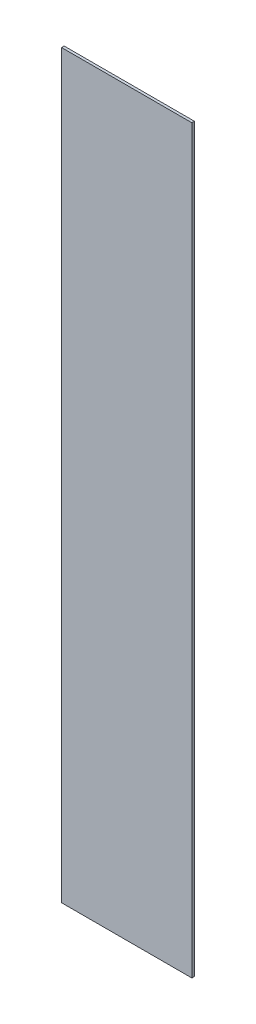
ISO-10303-21;
HEADER;
FILE_DESCRIPTION(('STEP AP214'),'2;1');
FILE_NAME('part.step','',(''),(''),'','','');
FILE_SCHEMA(('AUTOMOTIVE_DESIGN { 1 0 10303 214 1 1 1 1 }'));
ENDSEC;
DATA;
#1=APPLICATION_CONTEXT('core data for automotive mechanical design processes');
#2=APPLICATION_PROTOCOL_DEFINITION('international standard','automotive_design',2000,#1);
#3=PRODUCT_CONTEXT('',#1,'mechanical');
#4=PRODUCT('Part','Part','',(#3));
#5=PRODUCT_RELATED_PRODUCT_CATEGORY('part','',(#4));
#6=PRODUCT_DEFINITION_FORMATION('','',#4);
#7=PRODUCT_DEFINITION_CONTEXT('part definition',#1,'design');
#8=PRODUCT_DEFINITION('design','',#6,#7);
#9=PRODUCT_DEFINITION_SHAPE('','',#8);
#10=(LENGTH_UNIT() NAMED_UNIT(*) SI_UNIT(.MILLI.,.METRE.));
#11=(NAMED_UNIT(*) PLANE_ANGLE_UNIT() SI_UNIT($,.RADIAN.));
#12=(NAMED_UNIT(*) SI_UNIT($,.STERADIAN.) SOLID_ANGLE_UNIT());
#13=UNCERTAINTY_MEASURE_WITH_UNIT(LENGTH_MEASURE(1.E-05),#10,'distance_accuracy_value','');
#14=(GEOMETRIC_REPRESENTATION_CONTEXT(3) GLOBAL_UNCERTAINTY_ASSIGNED_CONTEXT((#13)) GLOBAL_UNIT_ASSIGNED_CONTEXT((#10,
#11,#12)) REPRESENTATION_CONTEXT('',''));
#15=CARTESIAN_POINT('',(0.,0.,0.));
#16=DIRECTION('',(0.,0.,1.));
#17=DIRECTION('',(1.,0.,0.));
#18=AXIS2_PLACEMENT_3D('',#15,#16,#17);
#19=CARTESIAN_POINT('',(92.364667770762,49.250000717584,-2.951522083282));
#20=DIRECTION('',(0.,8.74227765734797E-08,-0.999999999999996));
#21=DIRECTION('',(0.,0.999999999999996,8.74227765734797E-08));
#22=AXIS2_PLACEMENT_3D('',#19,#20,#21);
#23=PLANE('',#22);
#24=DIRECTION('',(1.,0.,0.));
#25=VECTOR('',#24,1.);
#26=CARTESIAN_POINT('',(92.364667770762,49.960334166822,-2.95152202118268));
#27=LINE('',#26,#25);
#28=CARTESIAN_POINT('',(92.239667770762,49.960334166822,-2.95152205223259));
#29=VERTEX_POINT('',#28);
#30=CARTESIAN_POINT('',(92.489667770762,49.9603341669313,-2.95152202118284));
#31=VERTEX_POINT('',#30);
#32=EDGE_CURVE('E20',#29,#31,#27,.T.);
#33=ORIENTED_EDGE('',*,*,#32,.F.);
#34=DIRECTION('',(0.,1.,0.));
#35=VECTOR('',#34,1.);
#36=CARTESIAN_POINT('',(92.239667770762,48.539667268346,-2.951522145382));
#37=LINE('',#36,#35);
#38=CARTESIAN_POINT('',(92.239667770762,48.5396672684553,-2.95152214538166));
#39=VERTEX_POINT('',#38);
#40=EDGE_CURVE('E55',#39,#29,#37,.T.);
#41=ORIENTED_EDGE('',*,*,#40,.F.);
#42=DIRECTION('',(1.,0.,0.));
#43=VECTOR('',#42,1.);
#44=CARTESIAN_POINT('',(92.489667770762,48.539667268346,-2.951522145382));
#45=LINE('',#44,#43);
#46=CARTESIAN_POINT('',(92.489667770762,48.539667268346,-2.95152211433191));
#47=VERTEX_POINT('',#46);
#48=EDGE_CURVE('E58',#47,#39,#45,.F.);
#49=ORIENTED_EDGE('',*,*,#48,.F.);
#50=DIRECTION('',(0.,1.,0.));
#51=VECTOR('',#50,1.);
#52=CARTESIAN_POINT('',(92.489667770762,49.960334166822,-2.951522021183));
#53=LINE('',#52,#51);
#54=EDGE_CURVE('E60',#31,#47,#53,.F.);
#55=ORIENTED_EDGE('',*,*,#54,.F.);
#56=EDGE_LOOP('',(#33,#41,#49,#55));
#57=FACE_BOUND('',#56,.T.);
#58=ADVANCED_FACE('F17',(#57),#23,.F.);
#59=CARTESIAN_POINT('',(92.489667770762,49.960334166822,-2.951522021183));
#60=DIRECTION('',(1.,0.,0.));
#61=DIRECTION('',(0.,0.,-1.));
#62=AXIS2_PLACEMENT_3D('',#59,#60,#61);
#63=PLANE('',#62);
#64=DIRECTION('',(0.,0.999999999999996,8.74227765734797E-08));
#65=VECTOR('',#64,1.);
#66=CARTESIAN_POINT('',(92.489667770762,49.250000718021,-2.956522083282));
#67=LINE('',#66,#65);
#68=CARTESIAN_POINT('',(92.489667770762,49.960334167259,-2.95652208328242));
#69=VERTEX_POINT('',#68);
#70=CARTESIAN_POINT('',(92.489667770762,48.5396672685645,-2.95652214538183));
#71=VERTEX_POINT('',#70);
#72=EDGE_CURVE('E83',#69,#71,#67,.F.);
#73=ORIENTED_EDGE('',*,*,#72,.F.);
#74=DIRECTION('',(0.,-8.74227765734797E-08,0.999999999999996));
#75=VECTOR('',#74,1.);
#76=CARTESIAN_POINT('',(92.489667770762,49.960334166822,-2.951522021183));
#77=LINE('',#76,#75);
#78=EDGE_CURVE('E71',#31,#69,#77,.F.);
#79=ORIENTED_EDGE('',*,*,#78,.F.);
#80=ORIENTED_EDGE('',*,*,#54,.T.);
#81=DIRECTION('',(0.,8.74227765734797E-08,-0.999999999999996));
#82=VECTOR('',#81,1.);
#83=CARTESIAN_POINT('',(92.489667770762,48.539667268346,-2.951522145382));
#84=LINE('',#83,#82);
#85=EDGE_CURVE('E65',#71,#47,#84,.F.);
#86=ORIENTED_EDGE('',*,*,#85,.F.);
#87=EDGE_LOOP('',(#73,#79,#80,#86));
#88=FACE_BOUND('',#87,.T.);
#89=ADVANCED_FACE('F68',(#88),#63,.T.);
#90=CARTESIAN_POINT('',(92.489667770762,48.539667268346,-2.951522145382));
#91=DIRECTION('',(0.,-0.999999999999996,-8.74227765734797E-08));
#92=DIRECTION('',(0.,8.74227765734797E-08,-0.999999999999996));
#93=AXIS2_PLACEMENT_3D('',#90,#91,#92);
#94=PLANE('',#93);
#95=DIRECTION('',(1.,0.,0.));
#96=VECTOR('',#95,1.);
#97=CARTESIAN_POINT('',(92.364667770762,48.539667268783,-2.95652214538132));
#98=LINE('',#97,#96);
#99=CARTESIAN_POINT('',(92.239667770762,48.5396672687831,-2.95652211433208));
#100=VERTEX_POINT('',#99);
#101=EDGE_CURVE('E74',#71,#100,#98,.F.);
#102=ORIENTED_EDGE('',*,*,#101,.F.);
#103=ORIENTED_EDGE('',*,*,#85,.T.);
#104=ORIENTED_EDGE('',*,*,#48,.T.);
#105=DIRECTION('',(0.,0.,1.));
#106=VECTOR('',#105,1.);
#107=CARTESIAN_POINT('',(92.239667770762,48.539667268783,-2.951522145382));
#108=LINE('',#107,#106);
#109=EDGE_CURVE('E77',#100,#39,#108,.T.);
#110=ORIENTED_EDGE('',*,*,#109,.F.);
#111=EDGE_LOOP('',(#102,#103,#104,#110));
#112=FACE_BOUND('',#111,.T.);
#113=ADVANCED_FACE('F72',(#112),#94,.T.);
#114=CARTESIAN_POINT('',(92.239667770762,48.539667268346,-2.951522145382));
#115=DIRECTION('',(-1.,0.,0.));
#116=DIRECTION('',(0.,0.,1.));
#117=AXIS2_PLACEMENT_3D('',#114,#115,#116);
#118=PLANE('',#117);
#119=DIRECTION('',(0.,0.999999999999996,8.74227765734797E-08));
#120=VECTOR('',#119,1.);
#121=CARTESIAN_POINT('',(92.239667770762,49.250000718021,-2.956522083282));
#122=LINE('',#121,#120);
#123=CARTESIAN_POINT('',(92.239667770762,49.9603341670405,-2.95652202118292));
#124=VERTEX_POINT('',#123);
#125=EDGE_CURVE('E26',#100,#124,#122,.T.);
#126=ORIENTED_EDGE('',*,*,#125,.F.);
#127=ORIENTED_EDGE('',*,*,#109,.T.);
#128=ORIENTED_EDGE('',*,*,#40,.T.);
#129=DIRECTION('',(0.,-8.74227765734797E-08,0.999999999999996));
#130=VECTOR('',#129,1.);
#131=CARTESIAN_POINT('',(92.239667770762,49.960334166822,-2.951522021183));
#132=LINE('',#131,#130);
#133=EDGE_CURVE('E35',#124,#29,#132,.T.);
#134=ORIENTED_EDGE('',*,*,#133,.F.);
#135=EDGE_LOOP('',(#126,#127,#128,#134));
#136=FACE_BOUND('',#135,.T.);
#137=ADVANCED_FACE('F89',(#136),#118,.T.);
#138=CARTESIAN_POINT('',(92.239667770762,49.960334166822,-2.951522021183));
#139=DIRECTION('',(0.,0.999999999999996,8.74227765734797E-08));
#140=DIRECTION('',(0.,-8.74227765734797E-08,0.999999999999996));
#141=AXIS2_PLACEMENT_3D('',#138,#139,#140);
#142=PLANE('',#141);
#143=DIRECTION('',(1.,0.,0.));
#144=VECTOR('',#143,1.);
#145=CARTESIAN_POINT('',(92.364667770762,49.960334167259,-2.95652202118268));
#146=LINE('',#145,#144);
#147=EDGE_CURVE('E11',#124,#69,#146,.T.);
#148=ORIENTED_EDGE('',*,*,#147,.F.);
#149=ORIENTED_EDGE('',*,*,#133,.T.);
#150=ORIENTED_EDGE('',*,*,#32,.T.);
#151=ORIENTED_EDGE('',*,*,#78,.T.);
#152=EDGE_LOOP('',(#148,#149,#150,#151));
#153=FACE_BOUND('',#152,.T.);
#154=ADVANCED_FACE('F91',(#153),#142,.T.);
#155=CARTESIAN_POINT('',(92.364667770762,49.250000718021,-2.956522083282));
#156=DIRECTION('',(0.,8.74227765734797E-08,-0.999999999999996));
#157=DIRECTION('',(0.,0.999999999999996,8.74227765734797E-08));
#158=AXIS2_PLACEMENT_3D('',#155,#156,#157);
#159=PLANE('',#158);
#160=ORIENTED_EDGE('',*,*,#125,.T.);
#161=ORIENTED_EDGE('',*,*,#147,.T.);
#162=ORIENTED_EDGE('',*,*,#72,.T.);
#163=ORIENTED_EDGE('',*,*,#101,.T.);
#164=EDGE_LOOP('',(#160,#161,#162,#163));
#165=FACE_BOUND('',#164,.T.);
#166=ADVANCED_FACE('F88',(#165),#159,.T.);
#167=CLOSED_SHELL('',(#58,#89,#113,#137,#154,#166));
#168=MANIFOLD_SOLID_BREP('B1',#167);
#169=ADVANCED_BREP_SHAPE_REPRESENTATION('',(#18,#168),#14);
#170=SHAPE_DEFINITION_REPRESENTATION(#9,#169);
ENDSEC;
END-ISO-10303-21;
